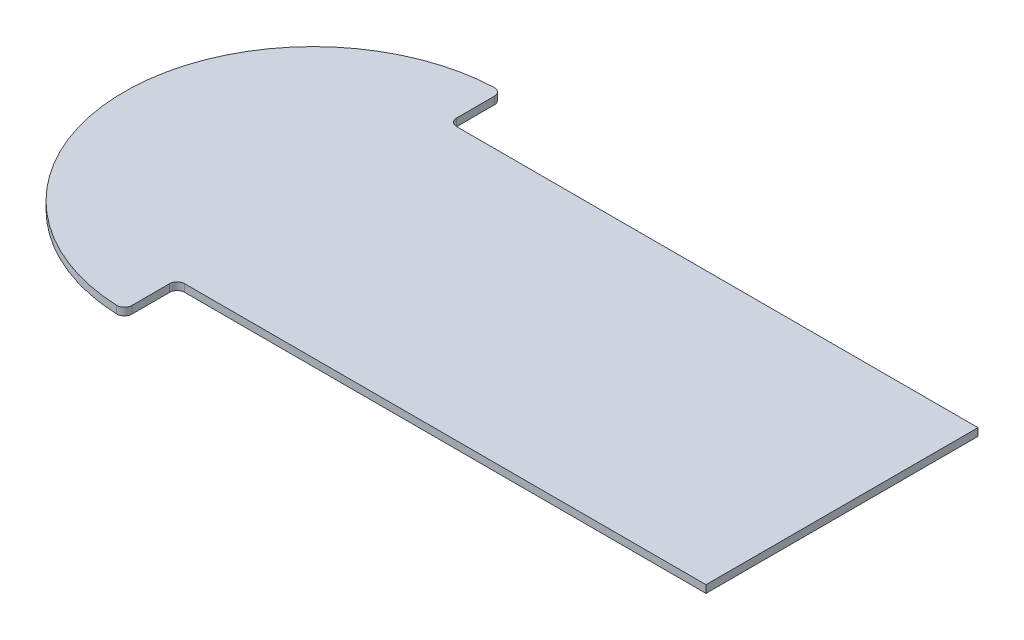
ISO-10303-21;
HEADER;
FILE_DESCRIPTION(('STEP AP214'),'2;1');
FILE_NAME('part.step','',(''),(''),'','','');
FILE_SCHEMA(('AUTOMOTIVE_DESIGN { 1 0 10303 214 1 1 1 1 }'));
ENDSEC;
DATA;
#1=APPLICATION_CONTEXT('core data for automotive mechanical design processes');
#2=APPLICATION_PROTOCOL_DEFINITION('international standard','automotive_design',2000,#1);
#3=PRODUCT_CONTEXT('',#1,'mechanical');
#4=PRODUCT('Part','Part','',(#3));
#5=PRODUCT_RELATED_PRODUCT_CATEGORY('part','',(#4));
#6=PRODUCT_DEFINITION_FORMATION('','',#4);
#7=PRODUCT_DEFINITION_CONTEXT('part definition',#1,'design');
#8=PRODUCT_DEFINITION('design','',#6,#7);
#9=PRODUCT_DEFINITION_SHAPE('','',#8);
#10=(LENGTH_UNIT() NAMED_UNIT(*) SI_UNIT(.MILLI.,.METRE.));
#11=(NAMED_UNIT(*) PLANE_ANGLE_UNIT() SI_UNIT($,.RADIAN.));
#12=(NAMED_UNIT(*) SI_UNIT($,.STERADIAN.) SOLID_ANGLE_UNIT());
#13=UNCERTAINTY_MEASURE_WITH_UNIT(LENGTH_MEASURE(1.E-05),#10,'distance_accuracy_value','');
#14=(GEOMETRIC_REPRESENTATION_CONTEXT(3) GLOBAL_UNCERTAINTY_ASSIGNED_CONTEXT((#13)) GLOBAL_UNIT_ASSIGNED_CONTEXT((#10,
#11,#12)) REPRESENTATION_CONTEXT('',''));
#15=CARTESIAN_POINT('',(0.,0.,0.));
#16=DIRECTION('',(0.,0.,1.));
#17=DIRECTION('',(1.,0.,0.));
#18=AXIS2_PLACEMENT_3D('',#15,#16,#17);
#19=CARTESIAN_POINT('',(-35.,1.,0.));
#20=DIRECTION('',(1.,0.,0.));
#21=DIRECTION('',(0.,0.,-1.));
#22=AXIS2_PLACEMENT_3D('',#19,#20,#21);
#23=PLANE('',#22);
#24=DIRECTION('',(0.,0.,1.));
#25=VECTOR('',#24,1.);
#26=CARTESIAN_POINT('',(-35.,1.,0.));
#27=LINE('',#26,#25);
#28=CARTESIAN_POINT('',(-35.,1.,-23.9791576165636));
#29=VERTEX_POINT('',#28);
#30=CARTESIAN_POINT('',(-35.,1.,-19.));
#31=VERTEX_POINT('',#30);
#32=EDGE_CURVE('E155',#29,#31,#27,.T.);
#33=ORIENTED_EDGE('',*,*,#32,.T.);
#34=DIRECTION('',(0.,-1.,0.));
#35=VECTOR('',#34,1.);
#36=CARTESIAN_POINT('',(-35.,1.,-19.));
#37=LINE('',#36,#35);
#38=CARTESIAN_POINT('',(-35.,0.,-19.));
#39=VERTEX_POINT('',#38);
#40=EDGE_CURVE('E191',#31,#39,#37,.T.);
#41=ORIENTED_EDGE('',*,*,#40,.T.);
#42=DIRECTION('',(0.,0.,1.));
#43=VECTOR('',#42,1.);
#44=CARTESIAN_POINT('',(-35.,0.,0.));
#45=LINE('',#44,#43);
#46=CARTESIAN_POINT('',(-35.,0.,-23.9791576165636));
#47=VERTEX_POINT('',#46);
#48=EDGE_CURVE('E160',#47,#39,#45,.T.);
#49=ORIENTED_EDGE('',*,*,#48,.F.);
#50=DIRECTION('',(0.,1.,0.));
#51=VECTOR('',#50,1.);
#52=CARTESIAN_POINT('',(-35.,1.,-23.9791576165636));
#53=LINE('',#52,#51);
#54=EDGE_CURVE('E188',#47,#29,#53,.T.);
#55=ORIENTED_EDGE('',*,*,#54,.T.);
#56=EDGE_LOOP('',(#33,#41,#49,#55));
#57=FACE_BOUND('',#56,.T.);
#58=ADVANCED_FACE('F41',(#57),#23,.T.);
#59=CARTESIAN_POINT('',(-35.,1.,0.));
#60=DIRECTION('',(0.,-1.,0.));
#61=DIRECTION('',(0.,0.,-1.));
#62=AXIS2_PLACEMENT_3D('',#59,#60,#61);
#63=CYLINDRICAL_SURFACE('',#62,25.);
#64=CARTESIAN_POINT('',(-35.,1.,0.));
#65=DIRECTION('',(0.,1.,0.));
#66=DIRECTION('',(0.,0.,1.));
#67=AXIS2_PLACEMENT_3D('',#64,#65,#66);
#68=CIRCLE('',#67,25.);
#69=CARTESIAN_POINT('',(-36.0416666666667,1.,-24.9782891839204));
#70=VERTEX_POINT('',#69);
#71=CARTESIAN_POINT('',(-36.0416666666667,1.,24.9782891839204));
#72=VERTEX_POINT('',#71);
#73=EDGE_CURVE('E153',#70,#72,#68,.T.);
#74=ORIENTED_EDGE('',*,*,#73,.F.);
#75=DIRECTION('',(0.,-1.,0.));
#76=VECTOR('',#75,1.);
#77=CARTESIAN_POINT('',(-36.0416666666667,1.,-24.9782891839204));
#78=LINE('',#77,#76);
#79=CARTESIAN_POINT('',(-36.0416666666667,0.,-24.9782891839204));
#80=VERTEX_POINT('',#79);
#81=EDGE_CURVE('E200',#70,#80,#78,.T.);
#82=ORIENTED_EDGE('',*,*,#81,.T.);
#83=CARTESIAN_POINT('',(-35.,0.,0.));
#84=DIRECTION('',(0.,1.,0.));
#85=DIRECTION('',(0.,0.,1.));
#86=AXIS2_PLACEMENT_3D('',#83,#84,#85);
#87=CIRCLE('',#86,25.);
#88=CARTESIAN_POINT('',(-36.0416666666667,0.,24.9782891839204));
#89=VERTEX_POINT('',#88);
#90=EDGE_CURVE('E164',#80,#89,#87,.T.);
#91=ORIENTED_EDGE('',*,*,#90,.T.);
#92=DIRECTION('',(0.,-1.,0.));
#93=VECTOR('',#92,1.);
#94=CARTESIAN_POINT('',(-36.0416666666667,1.,24.9782891839204));
#95=LINE('',#94,#93);
#96=EDGE_CURVE('E57',#89,#72,#95,.F.);
#97=ORIENTED_EDGE('',*,*,#96,.T.);
#98=EDGE_LOOP('',(#74,#82,#91,#97));
#99=FACE_BOUND('',#98,.T.);
#100=ADVANCED_FACE('F260',(#99),#63,.T.);
#101=CARTESIAN_POINT('',(-35.,0.,19.));
#102=VERTEX_POINT('',#101);
#103=CARTESIAN_POINT('',(-35.,0.,23.9791576165636));
#104=VERTEX_POINT('',#103);
#105=EDGE_CURVE('E165',#102,#104,#45,.T.);
#106=ORIENTED_EDGE('',*,*,#105,.F.);
#107=DIRECTION('',(0.,-1.,0.));
#108=VECTOR('',#107,1.);
#109=CARTESIAN_POINT('',(-35.,1.,19.));
#110=LINE('',#109,#108);
#111=CARTESIAN_POINT('',(-35.,1.,19.));
#112=VERTEX_POINT('',#111);
#113=EDGE_CURVE('E185',#102,#112,#110,.F.);
#114=ORIENTED_EDGE('',*,*,#113,.T.);
#115=CARTESIAN_POINT('',(-35.,1.,23.9791576165636));
#116=VERTEX_POINT('',#115);
#117=EDGE_CURVE('E149',#112,#116,#27,.T.);
#118=ORIENTED_EDGE('',*,*,#117,.T.);
#119=DIRECTION('',(0.,1.,0.));
#120=VECTOR('',#119,1.);
#121=CARTESIAN_POINT('',(-35.,0.,23.9791576165636));
#122=LINE('',#121,#120);
#123=EDGE_CURVE('E181',#116,#104,#122,.F.);
#124=ORIENTED_EDGE('',*,*,#123,.T.);
#125=EDGE_LOOP('',(#106,#114,#118,#124));
#126=FACE_BOUND('',#125,.T.);
#127=ADVANCED_FACE('F244',(#126),#23,.T.);
#128=CARTESIAN_POINT('',(0.,1.,18.));
#129=DIRECTION('',(0.,0.,1.));
#130=DIRECTION('',(1.,0.,0.));
#131=AXIS2_PLACEMENT_3D('',#128,#129,#130);
#132=PLANE('',#131);
#133=DIRECTION('',(-1.,0.,0.));
#134=VECTOR('',#133,1.);
#135=CARTESIAN_POINT('',(0.,1.,18.));
#136=LINE('',#135,#134);
#137=CARTESIAN_POINT('',(35.,1.,18.));
#138=VERTEX_POINT('',#137);
#139=CARTESIAN_POINT('',(-34.,1.,18.));
#140=VERTEX_POINT('',#139);
#141=EDGE_CURVE('E125',#138,#140,#136,.T.);
#142=ORIENTED_EDGE('',*,*,#141,.T.);
#143=DIRECTION('',(0.,-1.,0.));
#144=VECTOR('',#143,1.);
#145=CARTESIAN_POINT('',(-34.,0.,18.));
#146=LINE('',#145,#144);
#147=CARTESIAN_POINT('',(-34.,0.,18.));
#148=VERTEX_POINT('',#147);
#149=EDGE_CURVE('E132',#140,#148,#146,.T.);
#150=ORIENTED_EDGE('',*,*,#149,.T.);
#151=DIRECTION('',(-1.,0.,0.));
#152=VECTOR('',#151,1.);
#153=CARTESIAN_POINT('',(0.,0.,18.));
#154=LINE('',#153,#152);
#155=CARTESIAN_POINT('',(35.,0.,18.));
#156=VERTEX_POINT('',#155);
#157=EDGE_CURVE('E128',#156,#148,#154,.T.);
#158=ORIENTED_EDGE('',*,*,#157,.F.);
#159=DIRECTION('',(0.,-1.,0.));
#160=VECTOR('',#159,1.);
#161=CARTESIAN_POINT('',(35.,1.,18.));
#162=LINE('',#161,#160);
#163=EDGE_CURVE('E120',#138,#156,#162,.T.);
#164=ORIENTED_EDGE('',*,*,#163,.F.);
#165=EDGE_LOOP('',(#142,#150,#158,#164));
#166=FACE_BOUND('',#165,.T.);
#167=ADVANCED_FACE('F122',(#166),#132,.T.);
#168=CARTESIAN_POINT('',(35.,1.,0.));
#169=DIRECTION('',(-1.,0.,0.));
#170=DIRECTION('',(0.,0.,1.));
#171=AXIS2_PLACEMENT_3D('',#168,#169,#170);
#172=PLANE('',#171);
#173=DIRECTION('',(0.,0.,-1.));
#174=VECTOR('',#173,1.);
#175=CARTESIAN_POINT('',(35.,0.,0.));
#176=LINE('',#175,#174);
#177=CARTESIAN_POINT('',(35.,0.,-18.));
#178=VERTEX_POINT('',#177);
#179=EDGE_CURVE('E170',#156,#178,#176,.T.);
#180=ORIENTED_EDGE('',*,*,#179,.T.);
#181=DIRECTION('',(0.,-1.,0.));
#182=VECTOR('',#181,1.);
#183=CARTESIAN_POINT('',(35.,1.,-18.));
#184=LINE('',#183,#182);
#185=CARTESIAN_POINT('',(35.,1.,-18.));
#186=VERTEX_POINT('',#185);
#187=EDGE_CURVE('E133',#186,#178,#184,.T.);
#188=ORIENTED_EDGE('',*,*,#187,.F.);
#189=DIRECTION('',(0.,0.,-1.));
#190=VECTOR('',#189,1.);
#191=CARTESIAN_POINT('',(35.,1.,0.));
#192=LINE('',#191,#190);
#193=EDGE_CURVE('E136',#138,#186,#192,.T.);
#194=ORIENTED_EDGE('',*,*,#193,.F.);
#195=ORIENTED_EDGE('',*,*,#163,.T.);
#196=EDGE_LOOP('',(#180,#188,#194,#195));
#197=FACE_BOUND('',#196,.T.);
#198=ADVANCED_FACE('F137',(#197),#172,.F.);
#199=CARTESIAN_POINT('',(0.,1.,-18.));
#200=DIRECTION('',(0.,0.,1.));
#201=DIRECTION('',(1.,0.,0.));
#202=AXIS2_PLACEMENT_3D('',#199,#200,#201);
#203=PLANE('',#202);
#204=DIRECTION('',(-1.,0.,0.));
#205=VECTOR('',#204,1.);
#206=CARTESIAN_POINT('',(0.,0.,-18.));
#207=LINE('',#206,#205);
#208=CARTESIAN_POINT('',(-34.,0.,-18.));
#209=VERTEX_POINT('',#208);
#210=EDGE_CURVE('E173',#178,#209,#207,.T.);
#211=ORIENTED_EDGE('',*,*,#210,.T.);
#212=DIRECTION('',(0.,-1.,0.));
#213=VECTOR('',#212,1.);
#214=CARTESIAN_POINT('',(-34.,1.,-18.));
#215=LINE('',#214,#213);
#216=CARTESIAN_POINT('',(-34.,1.,-18.));
#217=VERTEX_POINT('',#216);
#218=EDGE_CURVE('E195',#209,#217,#215,.F.);
#219=ORIENTED_EDGE('',*,*,#218,.T.);
#220=DIRECTION('',(-1.,0.,0.));
#221=VECTOR('',#220,1.);
#222=CARTESIAN_POINT('',(0.,1.,-18.));
#223=LINE('',#222,#221);
#224=EDGE_CURVE('E142',#186,#217,#223,.T.);
#225=ORIENTED_EDGE('',*,*,#224,.F.);
#226=ORIENTED_EDGE('',*,*,#187,.T.);
#227=EDGE_LOOP('',(#211,#219,#225,#226));
#228=FACE_BOUND('',#227,.T.);
#229=ADVANCED_FACE('F229',(#228),#203,.F.);
#230=CARTESIAN_POINT('',(0.,1.,0.));
#231=DIRECTION('',(0.,1.,0.));
#232=DIRECTION('',(0.,0.,1.));
#233=AXIS2_PLACEMENT_3D('',#230,#231,#232);
#234=PLANE('',#233);
#235=ORIENTED_EDGE('',*,*,#32,.F.);
#236=CARTESIAN_POINT('',(-36.,1.,-23.9791576165636));
#237=DIRECTION('',(0.,1.,0.));
#238=DIRECTION('',(0.,0.,1.));
#239=AXIS2_PLACEMENT_3D('',#236,#237,#238);
#240=CIRCLE('',#239,1.);
#241=EDGE_CURVE('E64',#29,#70,#240,.T.);
#242=ORIENTED_EDGE('',*,*,#241,.T.);
#243=ORIENTED_EDGE('',*,*,#73,.T.);
#244=CARTESIAN_POINT('',(-36.,1.,23.9791576165636));
#245=DIRECTION('',(0.,1.,0.));
#246=DIRECTION('',(0.,0.,1.));
#247=AXIS2_PLACEMENT_3D('',#244,#245,#246);
#248=CIRCLE('',#247,1.);
#249=EDGE_CURVE('E210',#72,#116,#248,.T.);
#250=ORIENTED_EDGE('',*,*,#249,.T.);
#251=ORIENTED_EDGE('',*,*,#117,.F.);
#252=CARTESIAN_POINT('',(-34.,1.,19.));
#253=DIRECTION('',(0.,1.,0.));
#254=DIRECTION('',(0.,0.,1.));
#255=AXIS2_PLACEMENT_3D('',#252,#253,#254);
#256=CIRCLE('',#255,1.);
#257=EDGE_CURVE('E147',#112,#140,#256,.F.);
#258=ORIENTED_EDGE('',*,*,#257,.T.);
#259=ORIENTED_EDGE('',*,*,#141,.F.);
#260=ORIENTED_EDGE('',*,*,#193,.T.);
#261=ORIENTED_EDGE('',*,*,#224,.T.);
#262=CARTESIAN_POINT('',(-34.,1.,-19.));
#263=DIRECTION('',(0.,1.,0.));
#264=DIRECTION('',(0.,0.,1.));
#265=AXIS2_PLACEMENT_3D('',#262,#263,#264);
#266=CIRCLE('',#265,1.);
#267=EDGE_CURVE('E11',#217,#31,#266,.F.);
#268=ORIENTED_EDGE('',*,*,#267,.T.);
#269=EDGE_LOOP('',(#235,#242,#243,#250,#251,#258,#259,#260,#261,#268));
#270=FACE_BOUND('',#269,.T.);
#271=ADVANCED_FACE('F144',(#270),#234,.T.);
#272=CARTESIAN_POINT('',(0.,0.,0.));
#273=DIRECTION('',(0.,1.,0.));
#274=DIRECTION('',(0.,0.,1.));
#275=AXIS2_PLACEMENT_3D('',#272,#273,#274);
#276=PLANE('',#275);
#277=ORIENTED_EDGE('',*,*,#90,.F.);
#278=CARTESIAN_POINT('',(-36.,0.,-23.9791576165636));
#279=DIRECTION('',(0.,1.,0.));
#280=DIRECTION('',(0.,0.,1.));
#281=AXIS2_PLACEMENT_3D('',#278,#279,#280);
#282=CIRCLE('',#281,1.);
#283=EDGE_CURVE('E207',#80,#47,#282,.F.);
#284=ORIENTED_EDGE('',*,*,#283,.T.);
#285=ORIENTED_EDGE('',*,*,#48,.T.);
#286=CARTESIAN_POINT('',(-34.,0.,-19.));
#287=DIRECTION('',(0.,1.,0.));
#288=DIRECTION('',(0.,0.,1.));
#289=AXIS2_PLACEMENT_3D('',#286,#287,#288);
#290=CIRCLE('',#289,1.);
#291=EDGE_CURVE('E50',#39,#209,#290,.T.);
#292=ORIENTED_EDGE('',*,*,#291,.T.);
#293=ORIENTED_EDGE('',*,*,#210,.F.);
#294=ORIENTED_EDGE('',*,*,#179,.F.);
#295=ORIENTED_EDGE('',*,*,#157,.T.);
#296=CARTESIAN_POINT('',(-34.,0.,19.));
#297=DIRECTION('',(0.,1.,0.));
#298=DIRECTION('',(0.,0.,1.));
#299=AXIS2_PLACEMENT_3D('',#296,#297,#298);
#300=CIRCLE('',#299,1.);
#301=EDGE_CURVE('E215',#148,#102,#300,.T.);
#302=ORIENTED_EDGE('',*,*,#301,.T.);
#303=ORIENTED_EDGE('',*,*,#105,.T.);
#304=CARTESIAN_POINT('',(-36.,0.,23.9791576165636));
#305=DIRECTION('',(0.,1.,0.));
#306=DIRECTION('',(0.,0.,1.));
#307=AXIS2_PLACEMENT_3D('',#304,#305,#306);
#308=CIRCLE('',#307,1.);
#309=EDGE_CURVE('E204',#104,#89,#308,.F.);
#310=ORIENTED_EDGE('',*,*,#309,.T.);
#311=EDGE_LOOP('',(#277,#284,#285,#292,#293,#294,#295,#302,#303,#310));
#312=FACE_BOUND('',#311,.T.);
#313=ADVANCED_FACE('F223',(#312),#276,.F.);
#314=CARTESIAN_POINT('',(-34.,1.,19.));
#315=DIRECTION('',(0.,1.,0.));
#316=DIRECTION('',(0.,0.,1.));
#317=AXIS2_PLACEMENT_3D('',#314,#315,#316);
#318=CYLINDRICAL_SURFACE('',#317,1.);
#319=ORIENTED_EDGE('',*,*,#257,.F.);
#320=ORIENTED_EDGE('',*,*,#113,.F.);
#321=ORIENTED_EDGE('',*,*,#301,.F.);
#322=ORIENTED_EDGE('',*,*,#149,.F.);
#323=EDGE_LOOP('',(#319,#320,#321,#322));
#324=FACE_BOUND('',#323,.T.);
#325=ADVANCED_FACE('F248',(#324),#318,.F.);
#326=CARTESIAN_POINT('',(-34.,1.,-19.));
#327=DIRECTION('',(0.,-1.,0.));
#328=DIRECTION('',(0.,0.,-1.));
#329=AXIS2_PLACEMENT_3D('',#326,#327,#328);
#330=CYLINDRICAL_SURFACE('',#329,1.);
#331=ORIENTED_EDGE('',*,*,#267,.F.);
#332=ORIENTED_EDGE('',*,*,#218,.F.);
#333=ORIENTED_EDGE('',*,*,#291,.F.);
#334=ORIENTED_EDGE('',*,*,#40,.F.);
#335=EDGE_LOOP('',(#331,#332,#333,#334));
#336=FACE_BOUND('',#335,.T.);
#337=ADVANCED_FACE('F231',(#336),#330,.F.);
#338=CARTESIAN_POINT('',(-36.,1.,-23.9791576165636));
#339=DIRECTION('',(0.,-1.,0.));
#340=DIRECTION('',(0.,0.,-1.));
#341=AXIS2_PLACEMENT_3D('',#338,#339,#340);
#342=CYLINDRICAL_SURFACE('',#341,1.);
#343=ORIENTED_EDGE('',*,*,#241,.F.);
#344=ORIENTED_EDGE('',*,*,#54,.F.);
#345=ORIENTED_EDGE('',*,*,#283,.F.);
#346=ORIENTED_EDGE('',*,*,#81,.F.);
#347=EDGE_LOOP('',(#343,#344,#345,#346));
#348=FACE_BOUND('',#347,.T.);
#349=ADVANCED_FACE('F255',(#348),#342,.T.);
#350=CARTESIAN_POINT('',(-36.,1.,23.9791576165636));
#351=DIRECTION('',(0.,-1.,0.));
#352=DIRECTION('',(0.,0.,-1.));
#353=AXIS2_PLACEMENT_3D('',#350,#351,#352);
#354=CYLINDRICAL_SURFACE('',#353,1.);
#355=ORIENTED_EDGE('',*,*,#249,.F.);
#356=ORIENTED_EDGE('',*,*,#96,.F.);
#357=ORIENTED_EDGE('',*,*,#309,.F.);
#358=ORIENTED_EDGE('',*,*,#123,.F.);
#359=EDGE_LOOP('',(#355,#356,#357,#358));
#360=FACE_BOUND('',#359,.T.);
#361=ADVANCED_FACE('F43',(#360),#354,.T.);
#362=CLOSED_SHELL('',(#58,#100,#127,#167,#198,#229,#271,#313,#325,#337,#349,#361));
#363=MANIFOLD_SOLID_BREP('B2',#362);
#364=ADVANCED_BREP_SHAPE_REPRESENTATION('',(#18,#363),#14);
#365=SHAPE_DEFINITION_REPRESENTATION(#9,#364);
ENDSEC;
END-ISO-10303-21;
